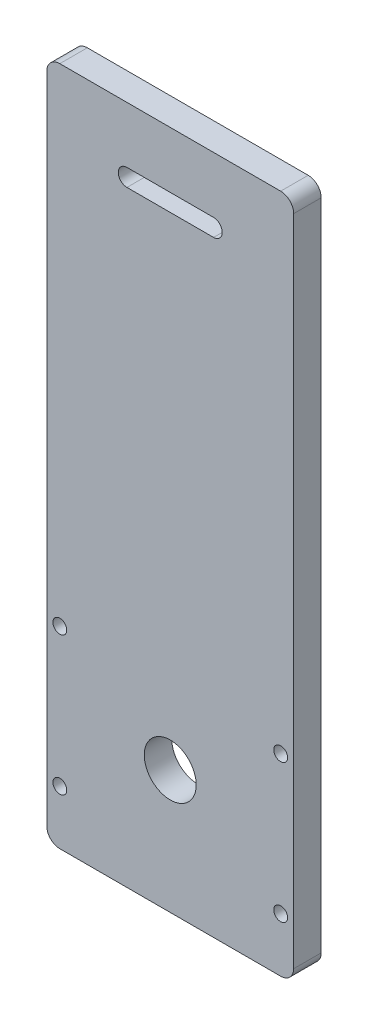
ISO-10303-21;
HEADER;
FILE_DESCRIPTION(('STEP AP214'),'2;1');
FILE_NAME('part.step','',(''),(''),'','','');
FILE_SCHEMA(('AUTOMOTIVE_DESIGN { 1 0 10303 214 1 1 1 1 }'));
ENDSEC;
DATA;
#1=APPLICATION_CONTEXT('core data for automotive mechanical design processes');
#2=APPLICATION_PROTOCOL_DEFINITION('international standard','automotive_design',2000,#1);
#3=PRODUCT_CONTEXT('',#1,'mechanical');
#4=PRODUCT('Part','Part','',(#3));
#5=PRODUCT_RELATED_PRODUCT_CATEGORY('part','',(#4));
#6=PRODUCT_DEFINITION_FORMATION('','',#4);
#7=PRODUCT_DEFINITION_CONTEXT('part definition',#1,'design');
#8=PRODUCT_DEFINITION('design','',#6,#7);
#9=PRODUCT_DEFINITION_SHAPE('','',#8);
#10=(LENGTH_UNIT() NAMED_UNIT(*) SI_UNIT(.MILLI.,.METRE.));
#11=(NAMED_UNIT(*) PLANE_ANGLE_UNIT() SI_UNIT($,.RADIAN.));
#12=(NAMED_UNIT(*) SI_UNIT($,.STERADIAN.) SOLID_ANGLE_UNIT());
#13=UNCERTAINTY_MEASURE_WITH_UNIT(LENGTH_MEASURE(1.E-05),#10,'distance_accuracy_value','');
#14=(GEOMETRIC_REPRESENTATION_CONTEXT(3) GLOBAL_UNCERTAINTY_ASSIGNED_CONTEXT((#13)) GLOBAL_UNIT_ASSIGNED_CONTEXT((#10,
#11,#12)) REPRESENTATION_CONTEXT('',''));
#15=CARTESIAN_POINT('',(0.,0.,0.));
#16=DIRECTION('',(0.,0.,1.));
#17=DIRECTION('',(1.,0.,0.));
#18=AXIS2_PLACEMENT_3D('',#15,#16,#17);
#19=CARTESIAN_POINT('',(-28.5,0.,6.35));
#20=DIRECTION('',(-1.,0.,0.));
#21=DIRECTION('',(0.,0.,1.));
#22=AXIS2_PLACEMENT_3D('',#19,#20,#21);
#23=PLANE('',#22);
#24=DIRECTION('',(0.,1.,0.));
#25=VECTOR('',#24,1.);
#26=CARTESIAN_POINT('',(-28.5,0.,6.35));
#27=LINE('',#26,#25);
#28=CARTESIAN_POINT('',(-28.5,-25.5,6.35));
#29=VERTEX_POINT('',#28);
#30=CARTESIAN_POINT('',(-28.5,125.5,6.35));
#31=VERTEX_POINT('',#30);
#32=EDGE_CURVE('E173',#29,#31,#27,.T.);
#33=ORIENTED_EDGE('',*,*,#32,.T.);
#34=DIRECTION('',(0.,0.,-1.));
#35=VECTOR('',#34,1.);
#36=CARTESIAN_POINT('',(-28.5,125.5,6.35));
#37=LINE('',#36,#35);
#38=CARTESIAN_POINT('',(-28.5,125.5,0.));
#39=VERTEX_POINT('',#38);
#40=EDGE_CURVE('E201',#31,#39,#37,.T.);
#41=ORIENTED_EDGE('',*,*,#40,.T.);
#42=DIRECTION('',(0.,1.,0.));
#43=VECTOR('',#42,1.);
#44=CARTESIAN_POINT('',(-28.5,0.,0.));
#45=LINE('',#44,#43);
#46=CARTESIAN_POINT('',(-28.5,-25.5,0.));
#47=VERTEX_POINT('',#46);
#48=EDGE_CURVE('E169',#47,#39,#45,.T.);
#49=ORIENTED_EDGE('',*,*,#48,.F.);
#50=DIRECTION('',(0.,0.,-1.));
#51=VECTOR('',#50,1.);
#52=CARTESIAN_POINT('',(-28.5,-25.5,6.35));
#53=LINE('',#52,#51);
#54=EDGE_CURVE('E187',#47,#29,#53,.F.);
#55=ORIENTED_EDGE('',*,*,#54,.T.);
#56=EDGE_LOOP('',(#33,#41,#49,#55));
#57=FACE_BOUND('',#56,.T.);
#58=ADVANCED_FACE('F34',(#57),#23,.T.);
#59=CARTESIAN_POINT('',(0.,-28.5,6.35));
#60=DIRECTION('',(0.,1.,0.));
#61=DIRECTION('',(0.,0.,1.));
#62=AXIS2_PLACEMENT_3D('',#59,#60,#61);
#63=PLANE('',#62);
#64=DIRECTION('',(1.,0.,0.));
#65=VECTOR('',#64,1.);
#66=CARTESIAN_POINT('',(0.,-28.5,6.35));
#67=LINE('',#66,#65);
#68=CARTESIAN_POINT('',(-25.5,-28.5,6.35));
#69=VERTEX_POINT('',#68);
#70=CARTESIAN_POINT('',(25.5,-28.5,6.35));
#71=VERTEX_POINT('',#70);
#72=EDGE_CURVE('E176',#69,#71,#67,.T.);
#73=ORIENTED_EDGE('',*,*,#72,.F.);
#74=DIRECTION('',(0.,0.,-1.));
#75=VECTOR('',#74,1.);
#76=CARTESIAN_POINT('',(-25.5,-28.5,0.));
#77=LINE('',#76,#75);
#78=CARTESIAN_POINT('',(-25.5,-28.5,0.));
#79=VERTEX_POINT('',#78);
#80=EDGE_CURVE('E11',#69,#79,#77,.T.);
#81=ORIENTED_EDGE('',*,*,#80,.T.);
#82=DIRECTION('',(1.,0.,0.));
#83=VECTOR('',#82,1.);
#84=CARTESIAN_POINT('',(0.,-28.5,0.));
#85=LINE('',#84,#83);
#86=CARTESIAN_POINT('',(25.5,-28.5,0.));
#87=VERTEX_POINT('',#86);
#88=EDGE_CURVE('E190',#79,#87,#85,.T.);
#89=ORIENTED_EDGE('',*,*,#88,.T.);
#90=DIRECTION('',(0.,0.,-1.));
#91=VECTOR('',#90,1.);
#92=CARTESIAN_POINT('',(25.5,-28.5,6.35));
#93=LINE('',#92,#91);
#94=EDGE_CURVE('E42',#87,#71,#93,.F.);
#95=ORIENTED_EDGE('',*,*,#94,.T.);
#96=EDGE_LOOP('',(#73,#81,#89,#95));
#97=FACE_BOUND('',#96,.T.);
#98=ADVANCED_FACE('F230',(#97),#63,.F.);
#99=CARTESIAN_POINT('',(28.5,0.,6.35));
#100=DIRECTION('',(-1.,0.,0.));
#101=DIRECTION('',(0.,0.,1.));
#102=AXIS2_PLACEMENT_3D('',#99,#100,#101);
#103=PLANE('',#102);
#104=DIRECTION('',(0.,1.,0.));
#105=VECTOR('',#104,1.);
#106=CARTESIAN_POINT('',(28.5,0.,0.));
#107=LINE('',#106,#105);
#108=CARTESIAN_POINT('',(28.5,-25.5,0.));
#109=VERTEX_POINT('',#108);
#110=CARTESIAN_POINT('',(28.5,125.5,0.));
#111=VERTEX_POINT('',#110);
#112=EDGE_CURVE('E193',#109,#111,#107,.T.);
#113=ORIENTED_EDGE('',*,*,#112,.T.);
#114=DIRECTION('',(0.,0.,-1.));
#115=VECTOR('',#114,1.);
#116=CARTESIAN_POINT('',(28.5,125.5,6.35));
#117=LINE('',#116,#115);
#118=CARTESIAN_POINT('',(28.5,125.5,6.35));
#119=VERTEX_POINT('',#118);
#120=EDGE_CURVE('E49',#111,#119,#117,.F.);
#121=ORIENTED_EDGE('',*,*,#120,.T.);
#122=DIRECTION('',(0.,1.,0.));
#123=VECTOR('',#122,1.);
#124=CARTESIAN_POINT('',(28.5,0.,6.35));
#125=LINE('',#124,#123);
#126=CARTESIAN_POINT('',(28.5,-25.5,6.35));
#127=VERTEX_POINT('',#126);
#128=EDGE_CURVE('E179',#127,#119,#125,.T.);
#129=ORIENTED_EDGE('',*,*,#128,.F.);
#130=DIRECTION('',(0.,0.,-1.));
#131=VECTOR('',#130,1.);
#132=CARTESIAN_POINT('',(28.5,-25.5,6.35));
#133=LINE('',#132,#131);
#134=EDGE_CURVE('E224',#127,#109,#133,.T.);
#135=ORIENTED_EDGE('',*,*,#134,.T.);
#136=EDGE_LOOP('',(#113,#121,#129,#135));
#137=FACE_BOUND('',#136,.T.);
#138=ADVANCED_FACE('F241',(#137),#103,.F.);
#139=CARTESIAN_POINT('',(0.,128.5,6.35));
#140=DIRECTION('',(0.,1.,0.));
#141=DIRECTION('',(0.,0.,1.));
#142=AXIS2_PLACEMENT_3D('',#139,#140,#141);
#143=PLANE('',#142);
#144=DIRECTION('',(1.,0.,0.));
#145=VECTOR('',#144,1.);
#146=CARTESIAN_POINT('',(0.,128.5,0.));
#147=LINE('',#146,#145);
#148=CARTESIAN_POINT('',(-25.5,128.5,0.));
#149=VERTEX_POINT('',#148);
#150=CARTESIAN_POINT('',(25.5,128.5,0.));
#151=VERTEX_POINT('',#150);
#152=EDGE_CURVE('E195',#149,#151,#147,.T.);
#153=ORIENTED_EDGE('',*,*,#152,.F.);
#154=DIRECTION('',(0.,0.,-1.));
#155=VECTOR('',#154,1.);
#156=CARTESIAN_POINT('',(-25.5,128.5,6.35));
#157=LINE('',#156,#155);
#158=CARTESIAN_POINT('',(-25.5,128.5,6.35));
#159=VERTEX_POINT('',#158);
#160=EDGE_CURVE('E215',#149,#159,#157,.F.);
#161=ORIENTED_EDGE('',*,*,#160,.T.);
#162=DIRECTION('',(1.,0.,0.));
#163=VECTOR('',#162,1.);
#164=CARTESIAN_POINT('',(0.,128.5,6.35));
#165=LINE('',#164,#163);
#166=CARTESIAN_POINT('',(25.5,128.5,6.35));
#167=VERTEX_POINT('',#166);
#168=EDGE_CURVE('E181',#159,#167,#165,.T.);
#169=ORIENTED_EDGE('',*,*,#168,.T.);
#170=DIRECTION('',(0.,0.,-1.));
#171=VECTOR('',#170,1.);
#172=CARTESIAN_POINT('',(25.5,128.5,0.));
#173=LINE('',#172,#171);
#174=EDGE_CURVE('E212',#167,#151,#173,.T.);
#175=ORIENTED_EDGE('',*,*,#174,.T.);
#176=EDGE_LOOP('',(#153,#161,#169,#175));
#177=FACE_BOUND('',#176,.T.);
#178=ADVANCED_FACE('F249',(#177),#143,.T.);
#179=CARTESIAN_POINT('',(0.,0.,6.35));
#180=DIRECTION('',(0.,0.,-1.));
#181=DIRECTION('',(-1.,0.,0.));
#182=AXIS2_PLACEMENT_3D('',#179,#180,#181);
#183=CYLINDRICAL_SURFACE('',#182,6.);
#184=CARTESIAN_POINT('',(0.,0.,6.35));
#185=DIRECTION('',(0.,0.,1.));
#186=DIRECTION('',(1.,0.,0.));
#187=AXIS2_PLACEMENT_3D('',#184,#185,#186);
#188=CIRCLE('',#187,6.);
#189=CARTESIAN_POINT('',(6.,0.,6.35));
#190=VERTEX_POINT('',#189);
#191=EDGE_CURVE('E184',#190,#190,#188,.T.);
#192=ORIENTED_EDGE('',*,*,#191,.T.);
#193=EDGE_LOOP('',(#192));
#194=FACE_BOUND('',#193,.T.);
#195=CARTESIAN_POINT('',(0.,0.,0.));
#196=DIRECTION('',(0.,0.,1.));
#197=DIRECTION('',(1.,0.,0.));
#198=AXIS2_PLACEMENT_3D('',#195,#196,#197);
#199=CIRCLE('',#198,6.);
#200=CARTESIAN_POINT('',(6.,0.,0.));
#201=VERTEX_POINT('',#200);
#202=EDGE_CURVE('E177',#201,#201,#199,.T.);
#203=ORIENTED_EDGE('',*,*,#202,.F.);
#204=EDGE_LOOP('',(#203));
#205=FACE_BOUND('',#204,.T.);
#206=ADVANCED_FACE('F293',(#194,#205),#183,.F.);
#207=CARTESIAN_POINT('',(0.,0.,6.35));
#208=DIRECTION('',(0.,0.,1.));
#209=DIRECTION('',(1.,0.,0.));
#210=AXIS2_PLACEMENT_3D('',#207,#208,#209);
#211=PLANE('',#210);
#212=CARTESIAN_POINT('',(-25.5,-16.,6.35));
#213=DIRECTION('',(0.,0.,1.));
#214=DIRECTION('',(-1.,0.,0.));
#215=AXIS2_PLACEMENT_3D('',#212,#213,#214);
#216=CIRCLE('',#215,1.6);
#217=CARTESIAN_POINT('',(-27.1,-16.,6.35));
#218=VERTEX_POINT('',#217);
#219=EDGE_CURVE('E443',#218,#218,#216,.T.);
#220=ORIENTED_EDGE('',*,*,#219,.F.);
#221=EDGE_LOOP('',(#220));
#222=FACE_BOUND('',#221,.T.);
#223=CARTESIAN_POINT('',(25.5,16.,6.35));
#224=DIRECTION('',(0.,0.,1.));
#225=DIRECTION('',(-1.,0.,0.));
#226=AXIS2_PLACEMENT_3D('',#223,#224,#225);
#227=CIRCLE('',#226,1.6);
#228=CARTESIAN_POINT('',(23.9,16.,6.35));
#229=VERTEX_POINT('',#228);
#230=EDGE_CURVE('E448',#229,#229,#227,.T.);
#231=ORIENTED_EDGE('',*,*,#230,.F.);
#232=EDGE_LOOP('',(#231));
#233=FACE_BOUND('',#232,.T.);
#234=CARTESIAN_POINT('',(-25.5,16.,6.35));
#235=DIRECTION('',(0.,0.,1.));
#236=DIRECTION('',(1.,0.,0.));
#237=AXIS2_PLACEMENT_3D('',#234,#235,#236);
#238=CIRCLE('',#237,1.6);
#239=CARTESIAN_POINT('',(-23.9,16.,6.35));
#240=VERTEX_POINT('',#239);
#241=EDGE_CURVE('E467',#240,#240,#238,.T.);
#242=ORIENTED_EDGE('',*,*,#241,.F.);
#243=EDGE_LOOP('',(#242));
#244=FACE_BOUND('',#243,.T.);
#245=CARTESIAN_POINT('',(25.5,-16.,6.35));
#246=DIRECTION('',(0.,0.,1.));
#247=DIRECTION('',(1.,0.,0.));
#248=AXIS2_PLACEMENT_3D('',#245,#246,#247);
#249=CIRCLE('',#248,1.6);
#250=CARTESIAN_POINT('',(27.1,-16.,6.35));
#251=VERTEX_POINT('',#250);
#252=EDGE_CURVE('E156',#251,#251,#249,.T.);
#253=ORIENTED_EDGE('',*,*,#252,.F.);
#254=EDGE_LOOP('',(#253));
#255=FACE_BOUND('',#254,.T.);
#256=CARTESIAN_POINT('',(-10.,113.5,6.35));
#257=DIRECTION('',(0.,0.,1.));
#258=DIRECTION('',(1.,0.,0.));
#259=AXIS2_PLACEMENT_3D('',#256,#257,#258);
#260=CIRCLE('',#259,2.);
#261=CARTESIAN_POINT('',(-10.,115.5,6.35));
#262=VERTEX_POINT('',#261);
#263=CARTESIAN_POINT('',(-10.,111.5,6.35));
#264=VERTEX_POINT('',#263);
#265=EDGE_CURVE('E132',#262,#264,#260,.T.);
#266=ORIENTED_EDGE('',*,*,#265,.F.);
#267=DIRECTION('',(-1.,0.,0.));
#268=VECTOR('',#267,1.);
#269=CARTESIAN_POINT('',(-10.,115.5,6.35));
#270=LINE('',#269,#268);
#271=CARTESIAN_POINT('',(10.,115.5,6.35));
#272=VERTEX_POINT('',#271);
#273=EDGE_CURVE('E150',#272,#262,#270,.T.);
#274=ORIENTED_EDGE('',*,*,#273,.F.);
#275=CARTESIAN_POINT('',(10.,113.5,6.35));
#276=DIRECTION('',(0.,0.,1.));
#277=DIRECTION('',(1.,0.,0.));
#278=AXIS2_PLACEMENT_3D('',#275,#276,#277);
#279=CIRCLE('',#278,2.);
#280=CARTESIAN_POINT('',(10.,111.5,6.35));
#281=VERTEX_POINT('',#280);
#282=EDGE_CURVE('E153',#281,#272,#279,.T.);
#283=ORIENTED_EDGE('',*,*,#282,.F.);
#284=DIRECTION('',(1.,0.,0.));
#285=VECTOR('',#284,1.);
#286=CARTESIAN_POINT('',(-10.,111.5,6.35));
#287=LINE('',#286,#285);
#288=EDGE_CURVE('E162',#264,#281,#287,.T.);
#289=ORIENTED_EDGE('',*,*,#288,.F.);
#290=EDGE_LOOP('',(#266,#274,#283,#289));
#291=FACE_BOUND('',#290,.T.);
#292=ORIENTED_EDGE('',*,*,#168,.F.);
#293=CARTESIAN_POINT('',(-25.5,125.5,6.35));
#294=DIRECTION('',(0.,0.,1.));
#295=DIRECTION('',(1.,0.,0.));
#296=AXIS2_PLACEMENT_3D('',#293,#294,#295);
#297=CIRCLE('',#296,3.);
#298=EDGE_CURVE('E222',#159,#31,#297,.T.);
#299=ORIENTED_EDGE('',*,*,#298,.T.);
#300=ORIENTED_EDGE('',*,*,#32,.F.);
#301=CARTESIAN_POINT('',(-25.5,-25.5,6.35));
#302=DIRECTION('',(0.,0.,1.));
#303=DIRECTION('',(1.,0.,0.));
#304=AXIS2_PLACEMENT_3D('',#301,#302,#303);
#305=CIRCLE('',#304,3.);
#306=EDGE_CURVE('E218',#29,#69,#305,.T.);
#307=ORIENTED_EDGE('',*,*,#306,.T.);
#308=ORIENTED_EDGE('',*,*,#72,.T.);
#309=CARTESIAN_POINT('',(25.5,-25.5,6.35));
#310=DIRECTION('',(0.,0.,1.));
#311=DIRECTION('',(1.,0.,0.));
#312=AXIS2_PLACEMENT_3D('',#309,#310,#311);
#313=CIRCLE('',#312,3.);
#314=EDGE_CURVE('E56',#71,#127,#313,.T.);
#315=ORIENTED_EDGE('',*,*,#314,.T.);
#316=ORIENTED_EDGE('',*,*,#128,.T.);
#317=CARTESIAN_POINT('',(25.5,125.5,6.35));
#318=DIRECTION('',(0.,0.,1.));
#319=DIRECTION('',(1.,0.,0.));
#320=AXIS2_PLACEMENT_3D('',#317,#318,#319);
#321=CIRCLE('',#320,3.);
#322=EDGE_CURVE('E220',#119,#167,#321,.T.);
#323=ORIENTED_EDGE('',*,*,#322,.T.);
#324=EDGE_LOOP('',(#292,#299,#300,#307,#308,#315,#316,#323));
#325=FACE_BOUND('',#324,.T.);
#326=ORIENTED_EDGE('',*,*,#191,.F.);
#327=EDGE_LOOP('',(#326));
#328=FACE_BOUND('',#327,.T.);
#329=ADVANCED_FACE('F235',(#222,#233,#244,#255,#291,#325,#328),#211,.T.);
#330=CARTESIAN_POINT('',(0.,0.,0.));
#331=DIRECTION('',(0.,0.,1.));
#332=DIRECTION('',(1.,0.,0.));
#333=AXIS2_PLACEMENT_3D('',#330,#331,#332);
#334=PLANE('',#333);
#335=CARTESIAN_POINT('',(-25.5,-16.,0.));
#336=DIRECTION('',(0.,0.,1.));
#337=DIRECTION('',(-1.,0.,0.));
#338=AXIS2_PLACEMENT_3D('',#335,#336,#337);
#339=CIRCLE('',#338,1.6);
#340=CARTESIAN_POINT('',(-27.1,-16.,0.));
#341=VERTEX_POINT('',#340);
#342=EDGE_CURVE('E440',#341,#341,#339,.T.);
#343=ORIENTED_EDGE('',*,*,#342,.T.);
#344=EDGE_LOOP('',(#343));
#345=FACE_BOUND('',#344,.T.);
#346=CARTESIAN_POINT('',(25.5,16.,0.));
#347=DIRECTION('',(0.,0.,1.));
#348=DIRECTION('',(-1.,0.,0.));
#349=AXIS2_PLACEMENT_3D('',#346,#347,#348);
#350=CIRCLE('',#349,1.6);
#351=CARTESIAN_POINT('',(23.9,16.,0.));
#352=VERTEX_POINT('',#351);
#353=EDGE_CURVE('E444',#352,#352,#350,.T.);
#354=ORIENTED_EDGE('',*,*,#353,.T.);
#355=EDGE_LOOP('',(#354));
#356=FACE_BOUND('',#355,.T.);
#357=CARTESIAN_POINT('',(-25.5,16.,0.));
#358=DIRECTION('',(0.,0.,1.));
#359=DIRECTION('',(1.,0.,0.));
#360=AXIS2_PLACEMENT_3D('',#357,#358,#359);
#361=CIRCLE('',#360,1.6);
#362=CARTESIAN_POINT('',(-23.9,16.,0.));
#363=VERTEX_POINT('',#362);
#364=EDGE_CURVE('E453',#363,#363,#361,.T.);
#365=ORIENTED_EDGE('',*,*,#364,.T.);
#366=EDGE_LOOP('',(#365));
#367=FACE_BOUND('',#366,.T.);
#368=CARTESIAN_POINT('',(25.5,-16.,0.));
#369=DIRECTION('',(0.,0.,1.));
#370=DIRECTION('',(1.,0.,0.));
#371=AXIS2_PLACEMENT_3D('',#368,#369,#370);
#372=CIRCLE('',#371,1.6);
#373=CARTESIAN_POINT('',(27.1,-16.,0.));
#374=VERTEX_POINT('',#373);
#375=EDGE_CURVE('E163',#374,#374,#372,.T.);
#376=ORIENTED_EDGE('',*,*,#375,.T.);
#377=EDGE_LOOP('',(#376));
#378=FACE_BOUND('',#377,.T.);
#379=DIRECTION('',(-1.,0.,0.));
#380=VECTOR('',#379,1.);
#381=CARTESIAN_POINT('',(-10.,115.5,0.));
#382=LINE('',#381,#380);
#383=CARTESIAN_POINT('',(10.,115.5,0.));
#384=VERTEX_POINT('',#383);
#385=CARTESIAN_POINT('',(-10.,115.5,0.));
#386=VERTEX_POINT('',#385);
#387=EDGE_CURVE('E137',#384,#386,#382,.T.);
#388=ORIENTED_EDGE('',*,*,#387,.T.);
#389=CARTESIAN_POINT('',(-10.,113.5,0.));
#390=DIRECTION('',(0.,0.,1.));
#391=DIRECTION('',(1.,0.,0.));
#392=AXIS2_PLACEMENT_3D('',#389,#390,#391);
#393=CIRCLE('',#392,2.);
#394=CARTESIAN_POINT('',(-10.,111.5,0.));
#395=VERTEX_POINT('',#394);
#396=EDGE_CURVE('E129',#386,#395,#393,.T.);
#397=ORIENTED_EDGE('',*,*,#396,.T.);
#398=DIRECTION('',(1.,0.,0.));
#399=VECTOR('',#398,1.);
#400=CARTESIAN_POINT('',(-10.,111.5,0.));
#401=LINE('',#400,#399);
#402=CARTESIAN_POINT('',(10.,111.5,0.));
#403=VERTEX_POINT('',#402);
#404=EDGE_CURVE('E141',#395,#403,#401,.T.);
#405=ORIENTED_EDGE('',*,*,#404,.T.);
#406=CARTESIAN_POINT('',(10.,113.5,0.));
#407=DIRECTION('',(0.,0.,1.));
#408=DIRECTION('',(1.,0.,0.));
#409=AXIS2_PLACEMENT_3D('',#406,#407,#408);
#410=CIRCLE('',#409,2.);
#411=EDGE_CURVE('E145',#403,#384,#410,.T.);
#412=ORIENTED_EDGE('',*,*,#411,.T.);
#413=EDGE_LOOP('',(#388,#397,#405,#412));
#414=FACE_BOUND('',#413,.T.);
#415=ORIENTED_EDGE('',*,*,#48,.T.);
#416=CARTESIAN_POINT('',(-25.5,125.5,0.));
#417=DIRECTION('',(0.,0.,1.));
#418=DIRECTION('',(1.,0.,0.));
#419=AXIS2_PLACEMENT_3D('',#416,#417,#418);
#420=CIRCLE('',#419,3.);
#421=EDGE_CURVE('E210',#39,#149,#420,.F.);
#422=ORIENTED_EDGE('',*,*,#421,.T.);
#423=ORIENTED_EDGE('',*,*,#152,.T.);
#424=CARTESIAN_POINT('',(25.5,125.5,0.));
#425=DIRECTION('',(0.,0.,1.));
#426=DIRECTION('',(1.,0.,0.));
#427=AXIS2_PLACEMENT_3D('',#424,#425,#426);
#428=CIRCLE('',#427,3.);
#429=EDGE_CURVE('E208',#151,#111,#428,.F.);
#430=ORIENTED_EDGE('',*,*,#429,.T.);
#431=ORIENTED_EDGE('',*,*,#112,.F.);
#432=CARTESIAN_POINT('',(25.5,-25.5,0.));
#433=DIRECTION('',(0.,0.,1.));
#434=DIRECTION('',(1.,0.,0.));
#435=AXIS2_PLACEMENT_3D('',#432,#433,#434);
#436=CIRCLE('',#435,3.);
#437=EDGE_CURVE('E204',#109,#87,#436,.F.);
#438=ORIENTED_EDGE('',*,*,#437,.T.);
#439=ORIENTED_EDGE('',*,*,#88,.F.);
#440=CARTESIAN_POINT('',(-25.5,-25.5,0.));
#441=DIRECTION('',(0.,0.,1.));
#442=DIRECTION('',(1.,0.,0.));
#443=AXIS2_PLACEMENT_3D('',#440,#441,#442);
#444=CIRCLE('',#443,3.);
#445=EDGE_CURVE('E206',#79,#47,#444,.F.);
#446=ORIENTED_EDGE('',*,*,#445,.T.);
#447=EDGE_LOOP('',(#415,#422,#423,#430,#431,#438,#439,#446));
#448=FACE_BOUND('',#447,.T.);
#449=ORIENTED_EDGE('',*,*,#202,.T.);
#450=EDGE_LOOP('',(#449));
#451=FACE_BOUND('',#450,.T.);
#452=ADVANCED_FACE('F147',(#345,#356,#367,#378,#414,#448,#451),#334,.F.);
#453=CARTESIAN_POINT('',(-10.,113.5,0.));
#454=DIRECTION('',(0.,0.,1.));
#455=DIRECTION('',(1.,0.,0.));
#456=AXIS2_PLACEMENT_3D('',#453,#454,#455);
#457=CYLINDRICAL_SURFACE('',#456,2.);
#458=ORIENTED_EDGE('',*,*,#265,.T.);
#459=DIRECTION('',(0.,0.,1.));
#460=VECTOR('',#459,1.);
#461=CARTESIAN_POINT('',(-10.,111.5,0.));
#462=LINE('',#461,#460);
#463=EDGE_CURVE('E125',#395,#264,#462,.T.);
#464=ORIENTED_EDGE('',*,*,#463,.F.);
#465=ORIENTED_EDGE('',*,*,#396,.F.);
#466=DIRECTION('',(0.,0.,1.));
#467=VECTOR('',#466,1.);
#468=CARTESIAN_POINT('',(-10.,115.5,0.));
#469=LINE('',#468,#467);
#470=EDGE_CURVE('E167',#386,#262,#469,.T.);
#471=ORIENTED_EDGE('',*,*,#470,.T.);
#472=EDGE_LOOP('',(#458,#464,#465,#471));
#473=FACE_BOUND('',#472,.T.);
#474=ADVANCED_FACE('F127',(#473),#457,.F.);
#475=CARTESIAN_POINT('',(-10.,115.5,0.));
#476=DIRECTION('',(0.,1.,0.));
#477=DIRECTION('',(0.,0.,1.));
#478=AXIS2_PLACEMENT_3D('',#475,#476,#477);
#479=PLANE('',#478);
#480=ORIENTED_EDGE('',*,*,#273,.T.);
#481=ORIENTED_EDGE('',*,*,#470,.F.);
#482=ORIENTED_EDGE('',*,*,#387,.F.);
#483=DIRECTION('',(0.,0.,1.));
#484=VECTOR('',#483,1.);
#485=CARTESIAN_POINT('',(10.,115.5,0.));
#486=LINE('',#485,#484);
#487=EDGE_CURVE('E170',#384,#272,#486,.T.);
#488=ORIENTED_EDGE('',*,*,#487,.T.);
#489=EDGE_LOOP('',(#480,#481,#482,#488));
#490=FACE_BOUND('',#489,.T.);
#491=ADVANCED_FACE('F284',(#490),#479,.F.);
#492=CARTESIAN_POINT('',(10.,113.5,0.));
#493=DIRECTION('',(0.,0.,1.));
#494=DIRECTION('',(1.,0.,0.));
#495=AXIS2_PLACEMENT_3D('',#492,#493,#494);
#496=CYLINDRICAL_SURFACE('',#495,2.);
#497=ORIENTED_EDGE('',*,*,#282,.T.);
#498=ORIENTED_EDGE('',*,*,#487,.F.);
#499=ORIENTED_EDGE('',*,*,#411,.F.);
#500=DIRECTION('',(0.,0.,1.));
#501=VECTOR('',#500,1.);
#502=CARTESIAN_POINT('',(10.,111.5,0.));
#503=LINE('',#502,#501);
#504=EDGE_CURVE('E136',#403,#281,#503,.T.);
#505=ORIENTED_EDGE('',*,*,#504,.T.);
#506=EDGE_LOOP('',(#497,#498,#499,#505));
#507=FACE_BOUND('',#506,.T.);
#508=ADVANCED_FACE('F279',(#507),#496,.F.);
#509=CARTESIAN_POINT('',(-10.,111.5,0.));
#510=DIRECTION('',(0.,-1.,0.));
#511=DIRECTION('',(0.,0.,-1.));
#512=AXIS2_PLACEMENT_3D('',#509,#510,#511);
#513=PLANE('',#512);
#514=ORIENTED_EDGE('',*,*,#288,.T.);
#515=ORIENTED_EDGE('',*,*,#504,.F.);
#516=ORIENTED_EDGE('',*,*,#404,.F.);
#517=ORIENTED_EDGE('',*,*,#463,.T.);
#518=EDGE_LOOP('',(#514,#515,#516,#517));
#519=FACE_BOUND('',#518,.T.);
#520=ADVANCED_FACE('F142',(#519),#513,.F.);
#521=CARTESIAN_POINT('',(-25.5,125.5,6.35));
#522=DIRECTION('',(0.,0.,-1.));
#523=DIRECTION('',(-1.,0.,0.));
#524=AXIS2_PLACEMENT_3D('',#521,#522,#523);
#525=CYLINDRICAL_SURFACE('',#524,3.);
#526=ORIENTED_EDGE('',*,*,#298,.F.);
#527=ORIENTED_EDGE('',*,*,#160,.F.);
#528=ORIENTED_EDGE('',*,*,#421,.F.);
#529=ORIENTED_EDGE('',*,*,#40,.F.);
#530=EDGE_LOOP('',(#526,#527,#528,#529));
#531=FACE_BOUND('',#530,.T.);
#532=ADVANCED_FACE('F254',(#531),#525,.T.);
#533=CARTESIAN_POINT('',(25.5,125.5,6.35));
#534=DIRECTION('',(0.,0.,1.));
#535=DIRECTION('',(1.,0.,0.));
#536=AXIS2_PLACEMENT_3D('',#533,#534,#535);
#537=CYLINDRICAL_SURFACE('',#536,3.);
#538=ORIENTED_EDGE('',*,*,#322,.F.);
#539=ORIENTED_EDGE('',*,*,#120,.F.);
#540=ORIENTED_EDGE('',*,*,#429,.F.);
#541=ORIENTED_EDGE('',*,*,#174,.F.);
#542=EDGE_LOOP('',(#538,#539,#540,#541));
#543=FACE_BOUND('',#542,.T.);
#544=ADVANCED_FACE('F247',(#543),#537,.T.);
#545=CARTESIAN_POINT('',(-25.5,-25.5,6.35));
#546=DIRECTION('',(0.,0.,1.));
#547=DIRECTION('',(1.,0.,0.));
#548=AXIS2_PLACEMENT_3D('',#545,#546,#547);
#549=CYLINDRICAL_SURFACE('',#548,3.);
#550=ORIENTED_EDGE('',*,*,#306,.F.);
#551=ORIENTED_EDGE('',*,*,#54,.F.);
#552=ORIENTED_EDGE('',*,*,#445,.F.);
#553=ORIENTED_EDGE('',*,*,#80,.F.);
#554=EDGE_LOOP('',(#550,#551,#552,#553));
#555=FACE_BOUND('',#554,.T.);
#556=ADVANCED_FACE('F259',(#555),#549,.T.);
#557=CARTESIAN_POINT('',(25.5,-25.5,6.35));
#558=DIRECTION('',(0.,0.,-1.));
#559=DIRECTION('',(-1.,0.,0.));
#560=AXIS2_PLACEMENT_3D('',#557,#558,#559);
#561=CYLINDRICAL_SURFACE('',#560,3.);
#562=ORIENTED_EDGE('',*,*,#314,.F.);
#563=ORIENTED_EDGE('',*,*,#94,.F.);
#564=ORIENTED_EDGE('',*,*,#437,.F.);
#565=ORIENTED_EDGE('',*,*,#134,.F.);
#566=EDGE_LOOP('',(#562,#563,#564,#565));
#567=FACE_BOUND('',#566,.T.);
#568=ADVANCED_FACE('F36',(#567),#561,.T.);
#569=CARTESIAN_POINT('',(25.5,-16.,0.));
#570=DIRECTION('',(0.,0.,1.));
#571=DIRECTION('',(1.,0.,0.));
#572=AXIS2_PLACEMENT_3D('',#569,#570,#571);
#573=CYLINDRICAL_SURFACE('',#572,1.6);
#574=ORIENTED_EDGE('',*,*,#375,.F.);
#575=EDGE_LOOP('',(#574));
#576=FACE_BOUND('',#575,.T.);
#577=ORIENTED_EDGE('',*,*,#252,.T.);
#578=EDGE_LOOP('',(#577));
#579=FACE_BOUND('',#578,.T.);
#580=ADVANCED_FACE('F265',(#576,#579),#573,.F.);
#581=CARTESIAN_POINT('',(-25.5,16.,0.));
#582=DIRECTION('',(0.,0.,1.));
#583=DIRECTION('',(1.,0.,0.));
#584=AXIS2_PLACEMENT_3D('',#581,#582,#583);
#585=CYLINDRICAL_SURFACE('',#584,1.6);
#586=ORIENTED_EDGE('',*,*,#364,.F.);
#587=EDGE_LOOP('',(#586));
#588=FACE_BOUND('',#587,.T.);
#589=ORIENTED_EDGE('',*,*,#241,.T.);
#590=EDGE_LOOP('',(#589));
#591=FACE_BOUND('',#590,.T.);
#592=ADVANCED_FACE('F403',(#588,#591),#585,.F.);
#593=CARTESIAN_POINT('',(25.5,16.,0.));
#594=DIRECTION('',(0.,0.,1.));
#595=DIRECTION('',(1.,0.,0.));
#596=AXIS2_PLACEMENT_3D('',#593,#594,#595);
#597=CYLINDRICAL_SURFACE('',#596,1.6);
#598=ORIENTED_EDGE('',*,*,#353,.F.);
#599=EDGE_LOOP('',(#598));
#600=FACE_BOUND('',#599,.T.);
#601=ORIENTED_EDGE('',*,*,#230,.T.);
#602=EDGE_LOOP('',(#601));
#603=FACE_BOUND('',#602,.T.);
#604=ADVANCED_FACE('F412',(#600,#603),#597,.F.);
#605=CARTESIAN_POINT('',(-25.5,-16.,0.));
#606=DIRECTION('',(0.,0.,1.));
#607=DIRECTION('',(1.,0.,0.));
#608=AXIS2_PLACEMENT_3D('',#605,#606,#607);
#609=CYLINDRICAL_SURFACE('',#608,1.6);
#610=ORIENTED_EDGE('',*,*,#342,.F.);
#611=EDGE_LOOP('',(#610));
#612=FACE_BOUND('',#611,.T.);
#613=ORIENTED_EDGE('',*,*,#219,.T.);
#614=EDGE_LOOP('',(#613));
#615=FACE_BOUND('',#614,.T.);
#616=ADVANCED_FACE('F421',(#612,#615),#609,.F.);
#617=CLOSED_SHELL('',(#58,#98,#138,#178,#206,#329,#452,#474,#491,#508,#520,#532,#544,#556,#568,
#580,#592,#604,#616));
#618=MANIFOLD_SOLID_BREP('B2',#617);
#619=ADVANCED_BREP_SHAPE_REPRESENTATION('',(#18,#618),#14);
#620=SHAPE_DEFINITION_REPRESENTATION(#9,#619);
ENDSEC;
END-ISO-10303-21;
